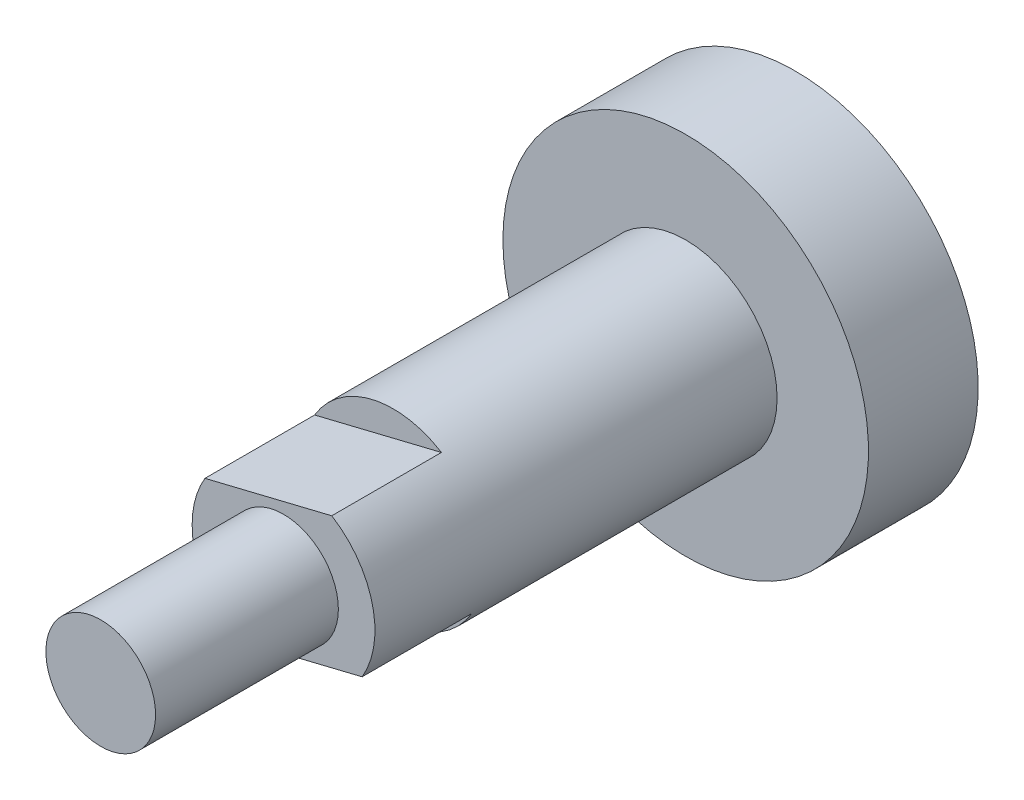
ISO-10303-21;
HEADER;
FILE_DESCRIPTION(('STEP AP214'),'2;1');
FILE_NAME('part.step','',(''),(''),'','','');
FILE_SCHEMA(('AUTOMOTIVE_DESIGN { 1 0 10303 214 1 1 1 1 }'));
ENDSEC;
DATA;
#1=APPLICATION_CONTEXT('core data for automotive mechanical design processes');
#2=APPLICATION_PROTOCOL_DEFINITION('international standard','automotive_design',2000,#1);
#3=PRODUCT_CONTEXT('',#1,'mechanical');
#4=PRODUCT('Part','Part','',(#3));
#5=PRODUCT_RELATED_PRODUCT_CATEGORY('part','',(#4));
#6=PRODUCT_DEFINITION_FORMATION('','',#4);
#7=PRODUCT_DEFINITION_CONTEXT('part definition',#1,'design');
#8=PRODUCT_DEFINITION('design','',#6,#7);
#9=PRODUCT_DEFINITION_SHAPE('','',#8);
#10=(LENGTH_UNIT() NAMED_UNIT(*) SI_UNIT(.MILLI.,.METRE.));
#11=(NAMED_UNIT(*) PLANE_ANGLE_UNIT() SI_UNIT($,.RADIAN.));
#12=(NAMED_UNIT(*) SI_UNIT($,.STERADIAN.) SOLID_ANGLE_UNIT());
#13=UNCERTAINTY_MEASURE_WITH_UNIT(LENGTH_MEASURE(1.E-05),#10,'distance_accuracy_value','');
#14=(GEOMETRIC_REPRESENTATION_CONTEXT(3) GLOBAL_UNCERTAINTY_ASSIGNED_CONTEXT((#13)) GLOBAL_UNIT_ASSIGNED_CONTEXT((#10,
#11,#12)) REPRESENTATION_CONTEXT('',''));
#15=CARTESIAN_POINT('',(0.,0.,0.));
#16=DIRECTION('',(0.,0.,1.));
#17=DIRECTION('',(1.,0.,0.));
#18=AXIS2_PLACEMENT_3D('',#15,#16,#17);
#19=CARTESIAN_POINT('',(0.,0.,22.));
#20=DIRECTION('',(0.,0.,-1.));
#21=DIRECTION('',(-1.,0.,0.));
#22=AXIS2_PLACEMENT_3D('',#19,#20,#21);
#23=CYLINDRICAL_SURFACE('',#22,5.);
#24=CARTESIAN_POINT('',(0.,0.,22.));
#25=DIRECTION('',(0.,0.,1.));
#26=DIRECTION('',(1.,0.,0.));
#27=AXIS2_PLACEMENT_3D('',#24,#25,#26);
#28=CIRCLE('',#27,5.);
#29=CARTESIAN_POINT('',(4.29920810179687,-2.552804281069,22.));
#30=VERTEX_POINT('',#29);
#31=CARTESIAN_POINT('',(2.63827783118239,4.24729208855378,22.));
#32=VERTEX_POINT('',#31);
#33=EDGE_CURVE('E42',#30,#32,#28,.T.);
#34=ORIENTED_EDGE('',*,*,#33,.F.);
#35=DIRECTION('',(0.,0.,1.));
#36=VECTOR('',#35,1.);
#37=CARTESIAN_POINT('',(4.29920810179687,-2.55280428106899,16.));
#38=LINE('',#37,#36);
#39=CARTESIAN_POINT('',(4.29920810179687,-2.55280428106899,16.));
#40=VERTEX_POINT('',#39);
#41=EDGE_CURVE('E49',#40,#30,#38,.T.);
#42=ORIENTED_EDGE('',*,*,#41,.F.);
#43=CARTESIAN_POINT('',(0.,0.,16.));
#44=DIRECTION('',(0.,0.,1.));
#45=DIRECTION('',(1.,0.,0.));
#46=AXIS2_PLACEMENT_3D('',#43,#44,#45);
#47=CIRCLE('',#46,5.);
#48=CARTESIAN_POINT('',(-2.63827783118242,-4.24729208855376,16.));
#49=VERTEX_POINT('',#48);
#50=EDGE_CURVE('E78',#49,#40,#47,.T.);
#51=ORIENTED_EDGE('',*,*,#50,.F.);
#52=DIRECTION('',(0.,0.,1.));
#53=VECTOR('',#52,1.);
#54=CARTESIAN_POINT('',(-2.63827783118242,-4.24729208855376,16.));
#55=LINE('',#54,#53);
#56=CARTESIAN_POINT('',(-2.63827783118242,-4.24729208855376,22.));
#57=VERTEX_POINT('',#56);
#58=EDGE_CURVE('E86',#49,#57,#55,.T.);
#59=ORIENTED_EDGE('',*,*,#58,.T.);
#60=CARTESIAN_POINT('',(-4.29920810179688,2.55280428106897,22.));
#61=VERTEX_POINT('',#60);
#62=EDGE_CURVE('E11',#61,#57,#28,.T.);
#63=ORIENTED_EDGE('',*,*,#62,.F.);
#64=DIRECTION('',(0.,0.,1.));
#65=VECTOR('',#64,1.);
#66=CARTESIAN_POINT('',(-4.29920810179688,2.55280428106897,16.));
#67=LINE('',#66,#65);
#68=CARTESIAN_POINT('',(-4.29920810179688,2.55280428106897,16.));
#69=VERTEX_POINT('',#68);
#70=EDGE_CURVE('E57',#69,#61,#67,.T.);
#71=ORIENTED_EDGE('',*,*,#70,.F.);
#72=CARTESIAN_POINT('',(0.,0.,16.));
#73=DIRECTION('',(0.,0.,1.));
#74=DIRECTION('',(1.,0.,0.));
#75=AXIS2_PLACEMENT_3D('',#72,#73,#74);
#76=CIRCLE('',#75,5.);
#77=CARTESIAN_POINT('',(2.63827783118239,4.24729208855378,16.));
#78=VERTEX_POINT('',#77);
#79=EDGE_CURVE('E96',#78,#69,#76,.T.);
#80=ORIENTED_EDGE('',*,*,#79,.F.);
#81=DIRECTION('',(0.,0.,1.));
#82=VECTOR('',#81,1.);
#83=CARTESIAN_POINT('',(2.63827783118239,4.24729208855378,16.));
#84=LINE('',#83,#82);
#85=EDGE_CURVE('E102',#78,#32,#84,.T.);
#86=ORIENTED_EDGE('',*,*,#85,.T.);
#87=EDGE_LOOP('',(#34,#42,#51,#59,#63,#71,#80,#86));
#88=FACE_BOUND('',#87,.T.);
#89=CARTESIAN_POINT('',(0.,0.,0.));
#90=DIRECTION('',(0.,0.,-1.));
#91=DIRECTION('',(-1.,0.,0.));
#92=AXIS2_PLACEMENT_3D('',#89,#90,#91);
#93=CIRCLE('',#92,5.);
#94=CARTESIAN_POINT('',(-5.,0.,0.));
#95=VERTEX_POINT('',#94);
#96=EDGE_CURVE('E130',#95,#95,#93,.T.);
#97=ORIENTED_EDGE('',*,*,#96,.F.);
#98=EDGE_LOOP('',(#97));
#99=FACE_BOUND('',#98,.T.);
#100=ADVANCED_FACE('F35',(#88,#99),#23,.T.);
#101=CARTESIAN_POINT('',(0.,0.,22.));
#102=DIRECTION('',(0.,0.,1.));
#103=DIRECTION('',(1.,0.,0.));
#104=AXIS2_PLACEMENT_3D('',#101,#102,#103);
#105=PLANE('',#104);
#106=CARTESIAN_POINT('',(0.,0.,22.));
#107=DIRECTION('',(0.,0.,1.));
#108=DIRECTION('',(1.,0.,0.));
#109=AXIS2_PLACEMENT_3D('',#106,#107,#108);
#110=CIRCLE('',#109,3.);
#111=CARTESIAN_POINT('',(3.,0.,22.));
#112=VERTEX_POINT('',#111);
#113=EDGE_CURVE('E127',#112,#112,#110,.T.);
#114=ORIENTED_EDGE('',*,*,#113,.F.);
#115=EDGE_LOOP('',(#114));
#116=FACE_BOUND('',#115,.T.);
#117=DIRECTION('',(-0.971442338517537,-0.237275752944921,0.));
#118=VECTOR('',#117,1.);
#119=CARTESIAN_POINT('',(-2.63827783118242,-4.24729208855376,22.));
#120=LINE('',#119,#118);
#121=EDGE_CURVE('E83',#30,#57,#120,.T.);
#122=ORIENTED_EDGE('',*,*,#121,.F.);
#123=ORIENTED_EDGE('',*,*,#33,.T.);
#124=DIRECTION('',(0.971442338517535,0.237275752944928,0.));
#125=VECTOR('',#124,1.);
#126=CARTESIAN_POINT('',(2.63827783118239,4.24729208855378,22.));
#127=LINE('',#126,#125);
#128=EDGE_CURVE('E92',#61,#32,#127,.T.);
#129=ORIENTED_EDGE('',*,*,#128,.F.);
#130=ORIENTED_EDGE('',*,*,#62,.T.);
#131=EDGE_LOOP('',(#122,#123,#129,#130));
#132=FACE_BOUND('',#131,.T.);
#133=ADVANCED_FACE('F105',(#116,#132),#105,.T.);
#134=CARTESIAN_POINT('',(2.63827783118239,4.24729208855378,16.));
#135=DIRECTION('',(0.237275752944928,-0.971442338517535,0.));
#136=DIRECTION('',(0.971442338517535,0.237275752944928,0.));
#137=AXIS2_PLACEMENT_3D('',#134,#135,#136);
#138=PLANE('',#137);
#139=ORIENTED_EDGE('',*,*,#128,.T.);
#140=ORIENTED_EDGE('',*,*,#85,.F.);
#141=DIRECTION('',(0.971442338517535,0.237275752944928,0.));
#142=VECTOR('',#141,1.);
#143=CARTESIAN_POINT('',(2.63827783118239,4.24729208855378,16.));
#144=LINE('',#143,#142);
#145=EDGE_CURVE('E98',#69,#78,#144,.T.);
#146=ORIENTED_EDGE('',*,*,#145,.F.);
#147=ORIENTED_EDGE('',*,*,#70,.T.);
#148=EDGE_LOOP('',(#139,#140,#146,#147));
#149=FACE_BOUND('',#148,.T.);
#150=ADVANCED_FACE('F107',(#149),#138,.F.);
#151=CARTESIAN_POINT('',(0.,0.,16.));
#152=DIRECTION('',(0.,0.,1.));
#153=DIRECTION('',(1.,0.,0.));
#154=AXIS2_PLACEMENT_3D('',#151,#152,#153);
#155=PLANE('',#154);
#156=ORIENTED_EDGE('',*,*,#79,.T.);
#157=ORIENTED_EDGE('',*,*,#145,.T.);
#158=EDGE_LOOP('',(#156,#157));
#159=FACE_BOUND('',#158,.T.);
#160=ADVANCED_FACE('F109',(#159),#155,.T.);
#161=CARTESIAN_POINT('',(-2.63827783118242,-4.24729208855376,16.));
#162=DIRECTION('',(-0.237275752944921,0.971442338517537,0.));
#163=DIRECTION('',(-0.971442338517537,-0.237275752944921,0.));
#164=AXIS2_PLACEMENT_3D('',#161,#162,#163);
#165=PLANE('',#164);
#166=ORIENTED_EDGE('',*,*,#121,.T.);
#167=ORIENTED_EDGE('',*,*,#58,.F.);
#168=DIRECTION('',(-0.971442338517537,-0.237275752944921,0.));
#169=VECTOR('',#168,1.);
#170=CARTESIAN_POINT('',(-2.63827783118242,-4.24729208855376,16.));
#171=LINE('',#170,#169);
#172=EDGE_CURVE('E80',#40,#49,#171,.T.);
#173=ORIENTED_EDGE('',*,*,#172,.F.);
#174=ORIENTED_EDGE('',*,*,#41,.T.);
#175=EDGE_LOOP('',(#166,#167,#173,#174));
#176=FACE_BOUND('',#175,.T.);
#177=ADVANCED_FACE('F85',(#176),#165,.F.);
#178=CARTESIAN_POINT('',(0.,0.,16.));
#179=DIRECTION('',(0.,0.,1.));
#180=DIRECTION('',(1.,0.,0.));
#181=AXIS2_PLACEMENT_3D('',#178,#179,#180);
#182=PLANE('',#181);
#183=ORIENTED_EDGE('',*,*,#50,.T.);
#184=ORIENTED_EDGE('',*,*,#172,.T.);
#185=EDGE_LOOP('',(#183,#184));
#186=FACE_BOUND('',#185,.T.);
#187=ADVANCED_FACE('F79',(#186),#182,.T.);
#188=CARTESIAN_POINT('',(0.,0.,32.));
#189=DIRECTION('',(0.,0.,-1.));
#190=DIRECTION('',(-1.,0.,0.));
#191=AXIS2_PLACEMENT_3D('',#188,#189,#190);
#192=CYLINDRICAL_SURFACE('',#191,3.);
#193=CARTESIAN_POINT('',(0.,0.,32.));
#194=DIRECTION('',(0.,0.,1.));
#195=DIRECTION('',(1.,0.,0.));
#196=AXIS2_PLACEMENT_3D('',#193,#194,#195);
#197=CIRCLE('',#196,3.);
#198=CARTESIAN_POINT('',(3.,0.,32.));
#199=VERTEX_POINT('',#198);
#200=EDGE_CURVE('E129',#199,#199,#197,.T.);
#201=ORIENTED_EDGE('',*,*,#200,.F.);
#202=EDGE_LOOP('',(#201));
#203=FACE_BOUND('',#202,.T.);
#204=ORIENTED_EDGE('',*,*,#113,.T.);
#205=EDGE_LOOP('',(#204));
#206=FACE_BOUND('',#205,.T.);
#207=ADVANCED_FACE('F164',(#203,#206),#192,.T.);
#208=CARTESIAN_POINT('',(0.,0.,32.));
#209=DIRECTION('',(0.,0.,1.));
#210=DIRECTION('',(1.,0.,0.));
#211=AXIS2_PLACEMENT_3D('',#208,#209,#210);
#212=PLANE('',#211);
#213=ORIENTED_EDGE('',*,*,#200,.T.);
#214=EDGE_LOOP('',(#213));
#215=FACE_BOUND('',#214,.T.);
#216=ADVANCED_FACE('F149',(#215),#212,.T.);
#217=CARTESIAN_POINT('',(0.,0.,-6.));
#218=DIRECTION('',(0.,0.,1.));
#219=DIRECTION('',(1.,0.,0.));
#220=AXIS2_PLACEMENT_3D('',#217,#218,#219);
#221=CYLINDRICAL_SURFACE('',#220,10.);
#222=CARTESIAN_POINT('',(0.,0.,-6.));
#223=DIRECTION('',(0.,0.,-1.));
#224=DIRECTION('',(-1.,0.,0.));
#225=AXIS2_PLACEMENT_3D('',#222,#223,#224);
#226=CIRCLE('',#225,10.);
#227=CARTESIAN_POINT('',(-10.,0.,-6.));
#228=VERTEX_POINT('',#227);
#229=EDGE_CURVE('E135',#228,#228,#226,.T.);
#230=ORIENTED_EDGE('',*,*,#229,.F.);
#231=EDGE_LOOP('',(#230));
#232=FACE_BOUND('',#231,.T.);
#233=CARTESIAN_POINT('',(0.,0.,0.));
#234=DIRECTION('',(0.,0.,-1.));
#235=DIRECTION('',(-1.,0.,0.));
#236=AXIS2_PLACEMENT_3D('',#233,#234,#235);
#237=CIRCLE('',#236,10.);
#238=CARTESIAN_POINT('',(-10.,0.,0.));
#239=VERTEX_POINT('',#238);
#240=EDGE_CURVE('E138',#239,#239,#237,.T.);
#241=ORIENTED_EDGE('',*,*,#240,.T.);
#242=EDGE_LOOP('',(#241));
#243=FACE_BOUND('',#242,.T.);
#244=ADVANCED_FACE('F146',(#232,#243),#221,.T.);
#245=CARTESIAN_POINT('',(0.,0.,-6.));
#246=DIRECTION('',(0.,0.,-1.));
#247=DIRECTION('',(-1.,0.,0.));
#248=AXIS2_PLACEMENT_3D('',#245,#246,#247);
#249=PLANE('',#248);
#250=ORIENTED_EDGE('',*,*,#229,.T.);
#251=EDGE_LOOP('',(#250));
#252=FACE_BOUND('',#251,.T.);
#253=ADVANCED_FACE('F144',(#252),#249,.T.);
#254=CARTESIAN_POINT('',(0.,0.,0.));
#255=DIRECTION('',(0.,0.,-1.));
#256=DIRECTION('',(-1.,0.,0.));
#257=AXIS2_PLACEMENT_3D('',#254,#255,#256);
#258=PLANE('',#257);
#259=ORIENTED_EDGE('',*,*,#96,.T.);
#260=EDGE_LOOP('',(#259));
#261=FACE_BOUND('',#260,.T.);
#262=ORIENTED_EDGE('',*,*,#240,.F.);
#263=EDGE_LOOP('',(#262));
#264=FACE_BOUND('',#263,.T.);
#265=ADVANCED_FACE('F153',(#261,#264),#258,.F.);
#266=CLOSED_SHELL('',(#100,#133,#150,#160,#177,#187,#207,#216,#244,#253,#265));
#267=MANIFOLD_SOLID_BREP('B2',#266);
#268=ADVANCED_BREP_SHAPE_REPRESENTATION('',(#18,#267),#14);
#269=SHAPE_DEFINITION_REPRESENTATION(#9,#268);
ENDSEC;
END-ISO-10303-21;
